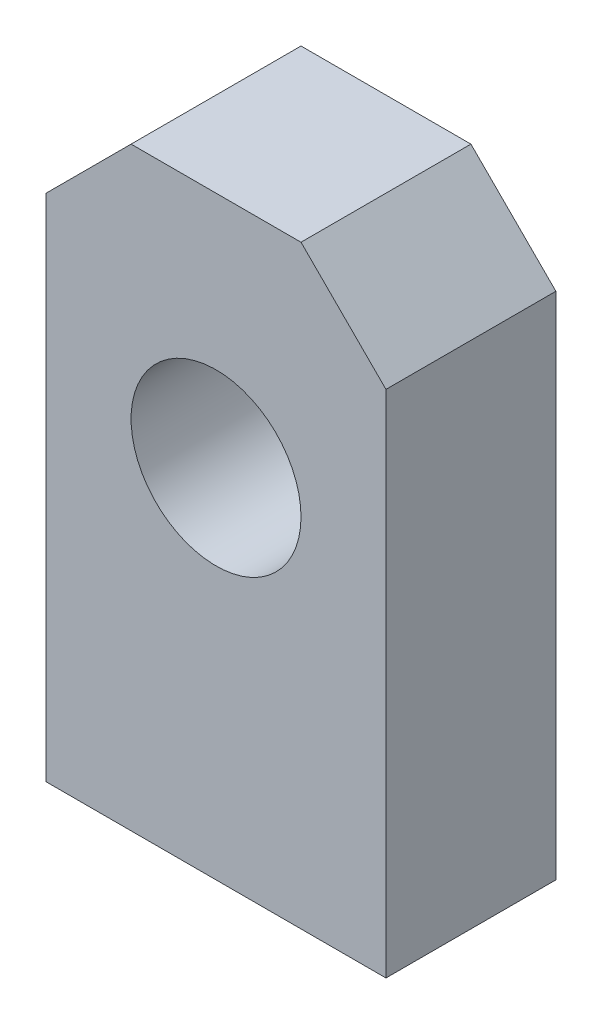
ISO-10303-21;
HEADER;
FILE_DESCRIPTION(('STEP AP214'),'2;1');
FILE_NAME('part.step','',(''),(''),'','','');
FILE_SCHEMA(('AUTOMOTIVE_DESIGN { 1 0 10303 214 1 1 1 1 }'));
ENDSEC;
DATA;
#1=APPLICATION_CONTEXT('core data for automotive mechanical design processes');
#2=APPLICATION_PROTOCOL_DEFINITION('international standard','automotive_design',2000,#1);
#3=PRODUCT_CONTEXT('',#1,'mechanical');
#4=PRODUCT('Part','Part','',(#3));
#5=PRODUCT_RELATED_PRODUCT_CATEGORY('part','',(#4));
#6=PRODUCT_DEFINITION_FORMATION('','',#4);
#7=PRODUCT_DEFINITION_CONTEXT('part definition',#1,'design');
#8=PRODUCT_DEFINITION('design','',#6,#7);
#9=PRODUCT_DEFINITION_SHAPE('','',#8);
#10=(LENGTH_UNIT() NAMED_UNIT(*) SI_UNIT(.MILLI.,.METRE.));
#11=(NAMED_UNIT(*) PLANE_ANGLE_UNIT() SI_UNIT($,.RADIAN.));
#12=(NAMED_UNIT(*) SI_UNIT($,.STERADIAN.) SOLID_ANGLE_UNIT());
#13=UNCERTAINTY_MEASURE_WITH_UNIT(LENGTH_MEASURE(1.E-05),#10,'distance_accuracy_value','');
#14=(GEOMETRIC_REPRESENTATION_CONTEXT(3) GLOBAL_UNCERTAINTY_ASSIGNED_CONTEXT((#13)) GLOBAL_UNIT_ASSIGNED_CONTEXT((#10,
#11,#12)) REPRESENTATION_CONTEXT('',''));
#15=CARTESIAN_POINT('',(0.,0.,0.));
#16=DIRECTION('',(0.,0.,1.));
#17=DIRECTION('',(1.,0.,0.));
#18=AXIS2_PLACEMENT_3D('',#15,#16,#17);
#19=CARTESIAN_POINT('',(10.,-17.5,10.));
#20=DIRECTION('',(-1.,0.,0.));
#21=DIRECTION('',(0.,0.,1.));
#22=AXIS2_PLACEMENT_3D('',#19,#20,#21);
#23=PLANE('',#22);
#24=DIRECTION('',(0.,1.,0.));
#25=VECTOR('',#24,1.);
#26=CARTESIAN_POINT('',(10.,-17.5,0.));
#27=LINE('',#26,#25);
#28=CARTESIAN_POINT('',(10.,-17.5,0.));
#29=VERTEX_POINT('',#28);
#30=CARTESIAN_POINT('',(10.,12.5,0.));
#31=VERTEX_POINT('',#30);
#32=EDGE_CURVE('E114',#29,#31,#27,.T.);
#33=ORIENTED_EDGE('',*,*,#32,.T.);
#34=DIRECTION('',(0.,0.,1.));
#35=VECTOR('',#34,1.);
#36=CARTESIAN_POINT('',(10.,12.5,10.));
#37=LINE('',#36,#35);
#38=CARTESIAN_POINT('',(10.,12.5,10.));
#39=VERTEX_POINT('',#38);
#40=EDGE_CURVE('E11',#31,#39,#37,.T.);
#41=ORIENTED_EDGE('',*,*,#40,.T.);
#42=DIRECTION('',(0.,1.,0.));
#43=VECTOR('',#42,1.);
#44=CARTESIAN_POINT('',(10.,-17.5,10.));
#45=LINE('',#44,#43);
#46=CARTESIAN_POINT('',(10.,-17.5,10.));
#47=VERTEX_POINT('',#46);
#48=EDGE_CURVE('E115',#47,#39,#45,.T.);
#49=ORIENTED_EDGE('',*,*,#48,.F.);
#50=DIRECTION('',(0.,0.,-1.));
#51=VECTOR('',#50,1.);
#52=CARTESIAN_POINT('',(10.,-17.5,10.));
#53=LINE('',#52,#51);
#54=EDGE_CURVE('E124',#47,#29,#53,.T.);
#55=ORIENTED_EDGE('',*,*,#54,.T.);
#56=EDGE_LOOP('',(#33,#41,#49,#55));
#57=FACE_BOUND('',#56,.T.);
#58=ADVANCED_FACE('F32',(#57),#23,.F.);
#59=CARTESIAN_POINT('',(-10.,17.5,10.));
#60=DIRECTION('',(0.,-1.,0.));
#61=DIRECTION('',(0.,0.,-1.));
#62=AXIS2_PLACEMENT_3D('',#59,#60,#61);
#63=PLANE('',#62);
#64=DIRECTION('',(-1.,0.,0.));
#65=VECTOR('',#64,1.);
#66=CARTESIAN_POINT('',(-10.,17.5,0.));
#67=LINE('',#66,#65);
#68=CARTESIAN_POINT('',(5.,17.5,0.));
#69=VERTEX_POINT('',#68);
#70=CARTESIAN_POINT('',(-5.,17.5,0.));
#71=VERTEX_POINT('',#70);
#72=EDGE_CURVE('E126',#69,#71,#67,.T.);
#73=ORIENTED_EDGE('',*,*,#72,.T.);
#74=DIRECTION('',(0.,0.,1.));
#75=VECTOR('',#74,1.);
#76=CARTESIAN_POINT('',(-5.,17.5,10.));
#77=LINE('',#76,#75);
#78=CARTESIAN_POINT('',(-5.,17.5,10.));
#79=VERTEX_POINT('',#78);
#80=EDGE_CURVE('E53',#71,#79,#77,.T.);
#81=ORIENTED_EDGE('',*,*,#80,.T.);
#82=DIRECTION('',(-1.,0.,0.));
#83=VECTOR('',#82,1.);
#84=CARTESIAN_POINT('',(-10.,17.5,10.));
#85=LINE('',#84,#83);
#86=CARTESIAN_POINT('',(5.,17.5,10.));
#87=VERTEX_POINT('',#86);
#88=EDGE_CURVE('E117',#87,#79,#85,.T.);
#89=ORIENTED_EDGE('',*,*,#88,.F.);
#90=DIRECTION('',(0.,0.,-1.));
#91=VECTOR('',#90,1.);
#92=CARTESIAN_POINT('',(5.,17.5,10.));
#93=LINE('',#92,#91);
#94=EDGE_CURVE('E143',#87,#69,#93,.T.);
#95=ORIENTED_EDGE('',*,*,#94,.T.);
#96=EDGE_LOOP('',(#73,#81,#89,#95));
#97=FACE_BOUND('',#96,.T.);
#98=ADVANCED_FACE('F164',(#97),#63,.F.);
#99=CARTESIAN_POINT('',(-10.,-17.5,10.));
#100=DIRECTION('',(1.,0.,0.));
#101=DIRECTION('',(0.,0.,-1.));
#102=AXIS2_PLACEMENT_3D('',#99,#100,#101);
#103=PLANE('',#102);
#104=DIRECTION('',(0.,-1.,0.));
#105=VECTOR('',#104,1.);
#106=CARTESIAN_POINT('',(-10.,-17.5,10.));
#107=LINE('',#106,#105);
#108=CARTESIAN_POINT('',(-10.,12.5,10.));
#109=VERTEX_POINT('',#108);
#110=CARTESIAN_POINT('',(-10.,-17.5,10.));
#111=VERTEX_POINT('',#110);
#112=EDGE_CURVE('E120',#109,#111,#107,.T.);
#113=ORIENTED_EDGE('',*,*,#112,.F.);
#114=DIRECTION('',(0.,0.,-1.));
#115=VECTOR('',#114,1.);
#116=CARTESIAN_POINT('',(-10.,12.5,10.));
#117=LINE('',#116,#115);
#118=CARTESIAN_POINT('',(-10.,12.5,0.));
#119=VERTEX_POINT('',#118);
#120=EDGE_CURVE('E136',#109,#119,#117,.T.);
#121=ORIENTED_EDGE('',*,*,#120,.T.);
#122=DIRECTION('',(0.,-1.,0.));
#123=VECTOR('',#122,1.);
#124=CARTESIAN_POINT('',(-10.,-17.5,0.));
#125=LINE('',#124,#123);
#126=CARTESIAN_POINT('',(-10.,-17.5,0.));
#127=VERTEX_POINT('',#126);
#128=EDGE_CURVE('E128',#119,#127,#125,.T.);
#129=ORIENTED_EDGE('',*,*,#128,.T.);
#130=DIRECTION('',(0.,0.,-1.));
#131=VECTOR('',#130,1.);
#132=CARTESIAN_POINT('',(-10.,-17.5,10.));
#133=LINE('',#132,#131);
#134=EDGE_CURVE('E133',#111,#127,#133,.T.);
#135=ORIENTED_EDGE('',*,*,#134,.F.);
#136=EDGE_LOOP('',(#113,#121,#129,#135));
#137=FACE_BOUND('',#136,.T.);
#138=ADVANCED_FACE('F156',(#137),#103,.F.);
#139=CARTESIAN_POINT('',(-10.,-17.5,10.));
#140=DIRECTION('',(0.,1.,0.));
#141=DIRECTION('',(0.,0.,1.));
#142=AXIS2_PLACEMENT_3D('',#139,#140,#141);
#143=PLANE('',#142);
#144=CARTESIAN_POINT('',(-6.,-17.5,5.));
#145=DIRECTION('',(0.,-1.,0.));
#146=DIRECTION('',(0.,0.,-1.));
#147=AXIS2_PLACEMENT_3D('',#144,#145,#146);
#148=CIRCLE('',#147,1.65);
#149=CARTESIAN_POINT('',(-6.,-17.5,3.35));
#150=VERTEX_POINT('',#149);
#151=EDGE_CURVE('E102',#150,#150,#148,.T.);
#152=ORIENTED_EDGE('',*,*,#151,.F.);
#153=EDGE_LOOP('',(#152));
#154=FACE_BOUND('',#153,.T.);
#155=CARTESIAN_POINT('',(6.,-17.5,5.));
#156=DIRECTION('',(0.,-1.,0.));
#157=DIRECTION('',(0.,0.,-1.));
#158=AXIS2_PLACEMENT_3D('',#155,#156,#157);
#159=CIRCLE('',#158,1.65);
#160=CARTESIAN_POINT('',(6.,-17.5,3.35));
#161=VERTEX_POINT('',#160);
#162=EDGE_CURVE('E101',#161,#161,#159,.T.);
#163=ORIENTED_EDGE('',*,*,#162,.F.);
#164=EDGE_LOOP('',(#163));
#165=FACE_BOUND('',#164,.T.);
#166=DIRECTION('',(1.,0.,0.));
#167=VECTOR('',#166,1.);
#168=CARTESIAN_POINT('',(-10.,-17.5,0.));
#169=LINE('',#168,#167);
#170=EDGE_CURVE('E118',#127,#29,#169,.T.);
#171=ORIENTED_EDGE('',*,*,#170,.T.);
#172=ORIENTED_EDGE('',*,*,#54,.F.);
#173=DIRECTION('',(1.,0.,0.));
#174=VECTOR('',#173,1.);
#175=CARTESIAN_POINT('',(-10.,-17.5,10.));
#176=LINE('',#175,#174);
#177=EDGE_CURVE('E122',#111,#47,#176,.T.);
#178=ORIENTED_EDGE('',*,*,#177,.F.);
#179=ORIENTED_EDGE('',*,*,#134,.T.);
#180=EDGE_LOOP('',(#171,#172,#178,#179));
#181=FACE_BOUND('',#180,.T.);
#182=ADVANCED_FACE('F171',(#154,#165,#181),#143,.F.);
#183=CARTESIAN_POINT('',(10.,17.5,10.));
#184=DIRECTION('',(0.,0.,-1.));
#185=DIRECTION('',(-1.,0.,0.));
#186=AXIS2_PLACEMENT_3D('',#183,#184,#185);
#187=PLANE('',#186);
#188=CARTESIAN_POINT('',(0.,3.50000000000001,10.));
#189=DIRECTION('',(0.,0.,1.));
#190=DIRECTION('',(1.,0.,0.));
#191=AXIS2_PLACEMENT_3D('',#188,#189,#190);
#192=CIRCLE('',#191,5.);
#193=CARTESIAN_POINT('',(5.,3.50000000000001,10.));
#194=VERTEX_POINT('',#193);
#195=EDGE_CURVE('E216',#194,#194,#192,.T.);
#196=ORIENTED_EDGE('',*,*,#195,.F.);
#197=EDGE_LOOP('',(#196));
#198=FACE_BOUND('',#197,.T.);
#199=ORIENTED_EDGE('',*,*,#88,.T.);
#200=DIRECTION('',(0.707106781186549,0.707106781186546,0.));
#201=VECTOR('',#200,1.);
#202=CARTESIAN_POINT('',(-10.,12.5,10.));
#203=LINE('',#202,#201);
#204=EDGE_CURVE('E40',#79,#109,#203,.F.);
#205=ORIENTED_EDGE('',*,*,#204,.T.);
#206=ORIENTED_EDGE('',*,*,#112,.T.);
#207=ORIENTED_EDGE('',*,*,#177,.T.);
#208=ORIENTED_EDGE('',*,*,#48,.T.);
#209=DIRECTION('',(0.707106781186546,-0.707106781186549,0.));
#210=VECTOR('',#209,1.);
#211=CARTESIAN_POINT('',(5.,17.5,10.));
#212=LINE('',#211,#210);
#213=EDGE_CURVE('E147',#39,#87,#212,.F.);
#214=ORIENTED_EDGE('',*,*,#213,.T.);
#215=EDGE_LOOP('',(#199,#205,#206,#207,#208,#214));
#216=FACE_BOUND('',#215,.T.);
#217=ADVANCED_FACE('F151',(#198,#216),#187,.F.);
#218=CARTESIAN_POINT('',(10.,17.5,0.));
#219=DIRECTION('',(0.,0.,-1.));
#220=DIRECTION('',(-1.,0.,0.));
#221=AXIS2_PLACEMENT_3D('',#218,#219,#220);
#222=PLANE('',#221);
#223=CARTESIAN_POINT('',(0.,3.50000000000001,0.));
#224=DIRECTION('',(0.,0.,1.));
#225=DIRECTION('',(1.,0.,0.));
#226=AXIS2_PLACEMENT_3D('',#223,#224,#225);
#227=CIRCLE('',#226,5.);
#228=CARTESIAN_POINT('',(5.,3.50000000000001,0.));
#229=VERTEX_POINT('',#228);
#230=EDGE_CURVE('E108',#229,#229,#227,.T.);
#231=ORIENTED_EDGE('',*,*,#230,.T.);
#232=EDGE_LOOP('',(#231));
#233=FACE_BOUND('',#232,.T.);
#234=ORIENTED_EDGE('',*,*,#128,.F.);
#235=DIRECTION('',(-0.707106781186549,-0.707106781186546,0.));
#236=VECTOR('',#235,1.);
#237=CARTESIAN_POINT('',(2.50000000000005,25.,0.));
#238=LINE('',#237,#236);
#239=EDGE_CURVE('E141',#119,#71,#238,.F.);
#240=ORIENTED_EDGE('',*,*,#239,.T.);
#241=ORIENTED_EDGE('',*,*,#72,.F.);
#242=DIRECTION('',(-0.707106781186546,0.707106781186549,0.));
#243=VECTOR('',#242,1.);
#244=CARTESIAN_POINT('',(7.5,15.,0.));
#245=LINE('',#244,#243);
#246=EDGE_CURVE('E139',#69,#31,#245,.F.);
#247=ORIENTED_EDGE('',*,*,#246,.T.);
#248=ORIENTED_EDGE('',*,*,#32,.F.);
#249=ORIENTED_EDGE('',*,*,#170,.F.);
#250=EDGE_LOOP('',(#234,#240,#241,#247,#248,#249));
#251=FACE_BOUND('',#250,.T.);
#252=ADVANCED_FACE('F162',(#233,#251),#222,.T.);
#253=CARTESIAN_POINT('',(6.,-6.,5.));
#254=DIRECTION('',(0.,-1.,0.));
#255=DIRECTION('',(0.,0.,-1.));
#256=AXIS2_PLACEMENT_3D('',#253,#254,#255);
#257=CONICAL_SURFACE('',#256,1.65,1.02974425867665);
#258=CARTESIAN_POINT('',(6.,-5.00857997860453,5.));
#259=VERTEX_POINT('',#258);
#260=VERTEX_LOOP('',#259);
#261=FACE_BOUND('',#260,.T.);
#262=CARTESIAN_POINT('',(6.,-6.,5.));
#263=DIRECTION('',(0.,-1.,0.));
#264=DIRECTION('',(0.,0.,-1.));
#265=AXIS2_PLACEMENT_3D('',#262,#263,#264);
#266=CIRCLE('',#265,1.65);
#267=CARTESIAN_POINT('',(6.,-6.,3.35));
#268=VERTEX_POINT('',#267);
#269=EDGE_CURVE('E105',#268,#268,#266,.T.);
#270=ORIENTED_EDGE('',*,*,#269,.T.);
#271=EDGE_LOOP('',(#270));
#272=FACE_BOUND('',#271,.T.);
#273=ADVANCED_FACE('F205',(#261,#272),#257,.F.);
#274=CARTESIAN_POINT('',(6.,-17.5,5.));
#275=DIRECTION('',(0.,-1.,0.));
#276=DIRECTION('',(0.,0.,-1.));
#277=AXIS2_PLACEMENT_3D('',#274,#275,#276);
#278=CYLINDRICAL_SURFACE('',#277,1.65);
#279=ORIENTED_EDGE('',*,*,#269,.F.);
#280=EDGE_LOOP('',(#279));
#281=FACE_BOUND('',#280,.T.);
#282=ORIENTED_EDGE('',*,*,#162,.T.);
#283=EDGE_LOOP('',(#282));
#284=FACE_BOUND('',#283,.T.);
#285=ADVANCED_FACE('F95',(#281,#284),#278,.F.);
#286=CARTESIAN_POINT('',(-6.,-6.,5.));
#287=DIRECTION('',(0.,-1.,0.));
#288=DIRECTION('',(0.,0.,-1.));
#289=AXIS2_PLACEMENT_3D('',#286,#287,#288);
#290=CONICAL_SURFACE('',#289,1.65,1.02974425867665);
#291=CARTESIAN_POINT('',(-6.,-5.00857997860453,5.));
#292=VERTEX_POINT('',#291);
#293=VERTEX_LOOP('',#292);
#294=FACE_BOUND('',#293,.T.);
#295=CARTESIAN_POINT('',(-6.,-6.,5.));
#296=DIRECTION('',(0.,-1.,0.));
#297=DIRECTION('',(0.,0.,-1.));
#298=AXIS2_PLACEMENT_3D('',#295,#296,#297);
#299=CIRCLE('',#298,1.65);
#300=CARTESIAN_POINT('',(-6.,-6.,3.35));
#301=VERTEX_POINT('',#300);
#302=EDGE_CURVE('E99',#301,#301,#299,.T.);
#303=ORIENTED_EDGE('',*,*,#302,.T.);
#304=EDGE_LOOP('',(#303));
#305=FACE_BOUND('',#304,.T.);
#306=ADVANCED_FACE('F91',(#294,#305),#290,.F.);
#307=CARTESIAN_POINT('',(-6.,-17.5,5.));
#308=DIRECTION('',(0.,-1.,0.));
#309=DIRECTION('',(0.,0.,-1.));
#310=AXIS2_PLACEMENT_3D('',#307,#308,#309);
#311=CYLINDRICAL_SURFACE('',#310,1.65);
#312=ORIENTED_EDGE('',*,*,#302,.F.);
#313=EDGE_LOOP('',(#312));
#314=FACE_BOUND('',#313,.T.);
#315=ORIENTED_EDGE('',*,*,#151,.T.);
#316=EDGE_LOOP('',(#315));
#317=FACE_BOUND('',#316,.T.);
#318=ADVANCED_FACE('F94',(#314,#317),#311,.F.);
#319=CARTESIAN_POINT('',(-10.,12.5,10.));
#320=DIRECTION('',(0.707106781186546,-0.707106781186549,0.));
#321=DIRECTION('',(0.707106781186549,0.707106781186546,0.));
#322=AXIS2_PLACEMENT_3D('',#319,#320,#321);
#323=PLANE('',#322);
#324=ORIENTED_EDGE('',*,*,#204,.F.);
#325=ORIENTED_EDGE('',*,*,#80,.F.);
#326=ORIENTED_EDGE('',*,*,#239,.F.);
#327=ORIENTED_EDGE('',*,*,#120,.F.);
#328=EDGE_LOOP('',(#324,#325,#326,#327));
#329=FACE_BOUND('',#328,.T.);
#330=ADVANCED_FACE('F159',(#329),#323,.F.);
#331=CARTESIAN_POINT('',(5.,17.5,10.));
#332=DIRECTION('',(-0.707106781186549,-0.707106781186546,0.));
#333=DIRECTION('',(0.707106781186546,-0.707106781186549,0.));
#334=AXIS2_PLACEMENT_3D('',#331,#332,#333);
#335=PLANE('',#334);
#336=ORIENTED_EDGE('',*,*,#213,.F.);
#337=ORIENTED_EDGE('',*,*,#40,.F.);
#338=ORIENTED_EDGE('',*,*,#246,.F.);
#339=ORIENTED_EDGE('',*,*,#94,.F.);
#340=EDGE_LOOP('',(#336,#337,#338,#339));
#341=FACE_BOUND('',#340,.T.);
#342=ADVANCED_FACE('F34',(#341),#335,.F.);
#343=CARTESIAN_POINT('',(0.,3.50000000000001,0.));
#344=DIRECTION('',(0.,0.,1.));
#345=DIRECTION('',(1.,0.,0.));
#346=AXIS2_PLACEMENT_3D('',#343,#344,#345);
#347=CYLINDRICAL_SURFACE('',#346,5.);
#348=ORIENTED_EDGE('',*,*,#230,.F.);
#349=EDGE_LOOP('',(#348));
#350=FACE_BOUND('',#349,.T.);
#351=ORIENTED_EDGE('',*,*,#195,.T.);
#352=EDGE_LOOP('',(#351));
#353=FACE_BOUND('',#352,.T.);
#354=ADVANCED_FACE('F196',(#350,#353),#347,.F.);
#355=CLOSED_SHELL('',(#58,#98,#138,#182,#217,#252,#273,#285,#306,#318,#330,#342,#354));
#356=MANIFOLD_SOLID_BREP('B2',#355);
#357=ADVANCED_BREP_SHAPE_REPRESENTATION('',(#18,#356),#14);
#358=SHAPE_DEFINITION_REPRESENTATION(#9,#357);
ENDSEC;
END-ISO-10303-21;
